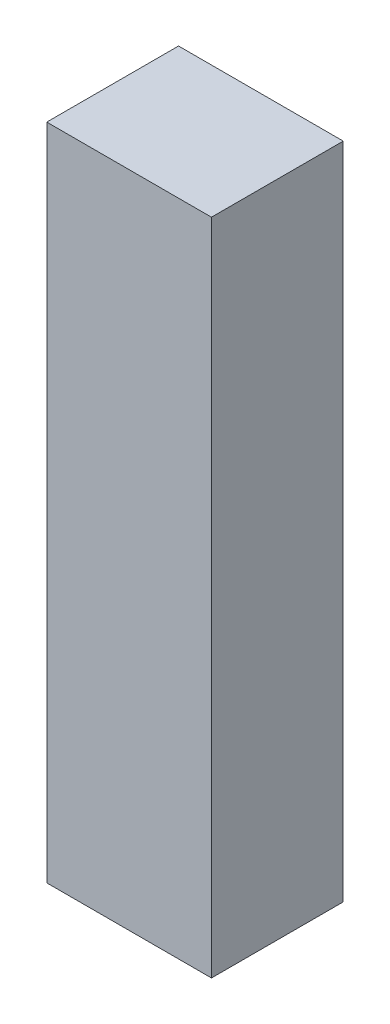
ISO-10303-21;
HEADER;
FILE_DESCRIPTION(('STEP AP214'),'2;1');
FILE_NAME('part.step','',(''),(''),'','','');
FILE_SCHEMA(('AUTOMOTIVE_DESIGN { 1 0 10303 214 1 1 1 1 }'));
ENDSEC;
DATA;
#1=APPLICATION_CONTEXT('core data for automotive mechanical design processes');
#2=APPLICATION_PROTOCOL_DEFINITION('international standard','automotive_design',2000,#1);
#3=PRODUCT_CONTEXT('',#1,'mechanical');
#4=PRODUCT('Part','Part','',(#3));
#5=PRODUCT_RELATED_PRODUCT_CATEGORY('part','',(#4));
#6=PRODUCT_DEFINITION_FORMATION('','',#4);
#7=PRODUCT_DEFINITION_CONTEXT('part definition',#1,'design');
#8=PRODUCT_DEFINITION('design','',#6,#7);
#9=PRODUCT_DEFINITION_SHAPE('','',#8);
#10=(LENGTH_UNIT() NAMED_UNIT(*) SI_UNIT(.MILLI.,.METRE.));
#11=(NAMED_UNIT(*) PLANE_ANGLE_UNIT() SI_UNIT($,.RADIAN.));
#12=(NAMED_UNIT(*) SI_UNIT($,.STERADIAN.) SOLID_ANGLE_UNIT());
#13=UNCERTAINTY_MEASURE_WITH_UNIT(LENGTH_MEASURE(1.E-05),#10,'distance_accuracy_value','');
#14=(GEOMETRIC_REPRESENTATION_CONTEXT(3) GLOBAL_UNCERTAINTY_ASSIGNED_CONTEXT((#13)) GLOBAL_UNIT_ASSIGNED_CONTEXT((#10,
#11,#12)) REPRESENTATION_CONTEXT('',''));
#15=CARTESIAN_POINT('',(0.,0.,0.));
#16=DIRECTION('',(0.,0.,1.));
#17=DIRECTION('',(1.,0.,0.));
#18=AXIS2_PLACEMENT_3D('',#15,#16,#17);
#19=CARTESIAN_POINT('',(280.,330.,-776.));
#20=DIRECTION('',(-1.,0.,0.));
#21=DIRECTION('',(0.,0.,1.));
#22=AXIS2_PLACEMENT_3D('',#19,#20,#21);
#23=PLANE('',#22);
#24=DIRECTION('',(0.,-1.,0.));
#25=VECTOR('',#24,1.);
#26=CARTESIAN_POINT('',(280.,330.,-736.));
#27=LINE('',#26,#25);
#28=CARTESIAN_POINT('',(280.,530.,-736.));
#29=VERTEX_POINT('',#28);
#30=CARTESIAN_POINT('',(280.,330.,-736.));
#31=VERTEX_POINT('',#30);
#32=EDGE_CURVE('E103',#29,#31,#27,.T.);
#33=ORIENTED_EDGE('',*,*,#32,.F.);
#34=DIRECTION('',(0.,0.,1.));
#35=VECTOR('',#34,1.);
#36=CARTESIAN_POINT('',(280.,530.,-776.));
#37=LINE('',#36,#35);
#38=CARTESIAN_POINT('',(280.,530.,-776.));
#39=VERTEX_POINT('',#38);
#40=EDGE_CURVE('E11',#39,#29,#37,.T.);
#41=ORIENTED_EDGE('',*,*,#40,.F.);
#42=DIRECTION('',(0.,-1.,0.));
#43=VECTOR('',#42,1.);
#44=CARTESIAN_POINT('',(280.,330.,-776.));
#45=LINE('',#44,#43);
#46=CARTESIAN_POINT('',(280.,330.,-776.));
#47=VERTEX_POINT('',#46);
#48=EDGE_CURVE('E97',#39,#47,#45,.T.);
#49=ORIENTED_EDGE('',*,*,#48,.T.);
#50=DIRECTION('',(0.,0.,1.));
#51=VECTOR('',#50,1.);
#52=CARTESIAN_POINT('',(280.,330.,-776.));
#53=LINE('',#52,#51);
#54=EDGE_CURVE('E42',#47,#31,#53,.T.);
#55=ORIENTED_EDGE('',*,*,#54,.T.);
#56=EDGE_LOOP('',(#33,#41,#49,#55));
#57=FACE_BOUND('',#56,.T.);
#58=ADVANCED_FACE('F39',(#57),#23,.T.);
#59=CARTESIAN_POINT('',(280.,530.,-776.));
#60=DIRECTION('',(0.,1.,0.));
#61=DIRECTION('',(0.,0.,1.));
#62=AXIS2_PLACEMENT_3D('',#59,#60,#61);
#63=PLANE('',#62);
#64=DIRECTION('',(-1.,0.,0.));
#65=VECTOR('',#64,1.);
#66=CARTESIAN_POINT('',(280.,530.,-736.));
#67=LINE('',#66,#65);
#68=CARTESIAN_POINT('',(330.,530.,-736.));
#69=VERTEX_POINT('',#68);
#70=EDGE_CURVE('E99',#69,#29,#67,.T.);
#71=ORIENTED_EDGE('',*,*,#70,.F.);
#72=DIRECTION('',(0.,0.,1.));
#73=VECTOR('',#72,1.);
#74=CARTESIAN_POINT('',(330.,530.,-776.));
#75=LINE('',#74,#73);
#76=CARTESIAN_POINT('',(330.,530.,-776.));
#77=VERTEX_POINT('',#76);
#78=EDGE_CURVE('E48',#77,#69,#75,.T.);
#79=ORIENTED_EDGE('',*,*,#78,.F.);
#80=DIRECTION('',(-1.,0.,0.));
#81=VECTOR('',#80,1.);
#82=CARTESIAN_POINT('',(280.,530.,-776.));
#83=LINE('',#82,#81);
#84=EDGE_CURVE('E94',#77,#39,#83,.T.);
#85=ORIENTED_EDGE('',*,*,#84,.T.);
#86=ORIENTED_EDGE('',*,*,#40,.T.);
#87=EDGE_LOOP('',(#71,#79,#85,#86));
#88=FACE_BOUND('',#87,.T.);
#89=ADVANCED_FACE('F113',(#88),#63,.T.);
#90=CARTESIAN_POINT('',(330.,330.,-776.));
#91=DIRECTION('',(1.,0.,0.));
#92=DIRECTION('',(0.,0.,-1.));
#93=AXIS2_PLACEMENT_3D('',#90,#91,#92);
#94=PLANE('',#93);
#95=DIRECTION('',(0.,1.,0.));
#96=VECTOR('',#95,1.);
#97=CARTESIAN_POINT('',(330.,330.,-736.));
#98=LINE('',#97,#96);
#99=CARTESIAN_POINT('',(330.,330.,-736.));
#100=VERTEX_POINT('',#99);
#101=EDGE_CURVE('E89',#100,#69,#98,.T.);
#102=ORIENTED_EDGE('',*,*,#101,.F.);
#103=DIRECTION('',(0.,0.,1.));
#104=VECTOR('',#103,1.);
#105=CARTESIAN_POINT('',(330.,330.,-776.));
#106=LINE('',#105,#104);
#107=CARTESIAN_POINT('',(330.,330.,-776.));
#108=VERTEX_POINT('',#107);
#109=EDGE_CURVE('E84',#108,#100,#106,.T.);
#110=ORIENTED_EDGE('',*,*,#109,.F.);
#111=DIRECTION('',(0.,1.,0.));
#112=VECTOR('',#111,1.);
#113=CARTESIAN_POINT('',(330.,330.,-776.));
#114=LINE('',#113,#112);
#115=EDGE_CURVE('E87',#108,#77,#114,.T.);
#116=ORIENTED_EDGE('',*,*,#115,.T.);
#117=ORIENTED_EDGE('',*,*,#78,.T.);
#118=EDGE_LOOP('',(#102,#110,#116,#117));
#119=FACE_BOUND('',#118,.T.);
#120=ADVANCED_FACE('F86',(#119),#94,.T.);
#121=CARTESIAN_POINT('',(280.,330.,-776.));
#122=DIRECTION('',(0.,-1.,0.));
#123=DIRECTION('',(0.,0.,-1.));
#124=AXIS2_PLACEMENT_3D('',#121,#122,#123);
#125=PLANE('',#124);
#126=DIRECTION('',(1.,0.,0.));
#127=VECTOR('',#126,1.);
#128=CARTESIAN_POINT('',(280.,330.,-736.));
#129=LINE('',#128,#127);
#130=EDGE_CURVE('E106',#31,#100,#129,.T.);
#131=ORIENTED_EDGE('',*,*,#130,.F.);
#132=ORIENTED_EDGE('',*,*,#54,.F.);
#133=DIRECTION('',(1.,0.,0.));
#134=VECTOR('',#133,1.);
#135=CARTESIAN_POINT('',(280.,330.,-776.));
#136=LINE('',#135,#134);
#137=EDGE_CURVE('E93',#47,#108,#136,.T.);
#138=ORIENTED_EDGE('',*,*,#137,.T.);
#139=ORIENTED_EDGE('',*,*,#109,.T.);
#140=EDGE_LOOP('',(#131,#132,#138,#139));
#141=FACE_BOUND('',#140,.T.);
#142=ADVANCED_FACE('F96',(#141),#125,.T.);
#143=CARTESIAN_POINT('',(0.,0.,-776.));
#144=DIRECTION('',(0.,0.,-1.));
#145=DIRECTION('',(-1.,0.,0.));
#146=AXIS2_PLACEMENT_3D('',#143,#144,#145);
#147=PLANE('',#146);
#148=ORIENTED_EDGE('',*,*,#48,.F.);
#149=ORIENTED_EDGE('',*,*,#84,.F.);
#150=ORIENTED_EDGE('',*,*,#115,.F.);
#151=ORIENTED_EDGE('',*,*,#137,.F.);
#152=EDGE_LOOP('',(#148,#149,#150,#151));
#153=FACE_BOUND('',#152,.T.);
#154=ADVANCED_FACE('F92',(#153),#147,.T.);
#155=CARTESIAN_POINT('',(0.,0.,-736.));
#156=DIRECTION('',(0.,0.,-1.));
#157=DIRECTION('',(-1.,0.,0.));
#158=AXIS2_PLACEMENT_3D('',#155,#156,#157);
#159=PLANE('',#158);
#160=ORIENTED_EDGE('',*,*,#32,.T.);
#161=ORIENTED_EDGE('',*,*,#130,.T.);
#162=ORIENTED_EDGE('',*,*,#101,.T.);
#163=ORIENTED_EDGE('',*,*,#70,.T.);
#164=EDGE_LOOP('',(#160,#161,#162,#163));
#165=FACE_BOUND('',#164,.T.);
#166=ADVANCED_FACE('F112',(#165),#159,.F.);
#167=CLOSED_SHELL('',(#58,#89,#120,#142,#154,#166));
#168=MANIFOLD_SOLID_BREP('B2',#167);
#169=ADVANCED_BREP_SHAPE_REPRESENTATION('',(#18,#168),#14);
#170=SHAPE_DEFINITION_REPRESENTATION(#9,#169);
ENDSEC;
END-ISO-10303-21;
